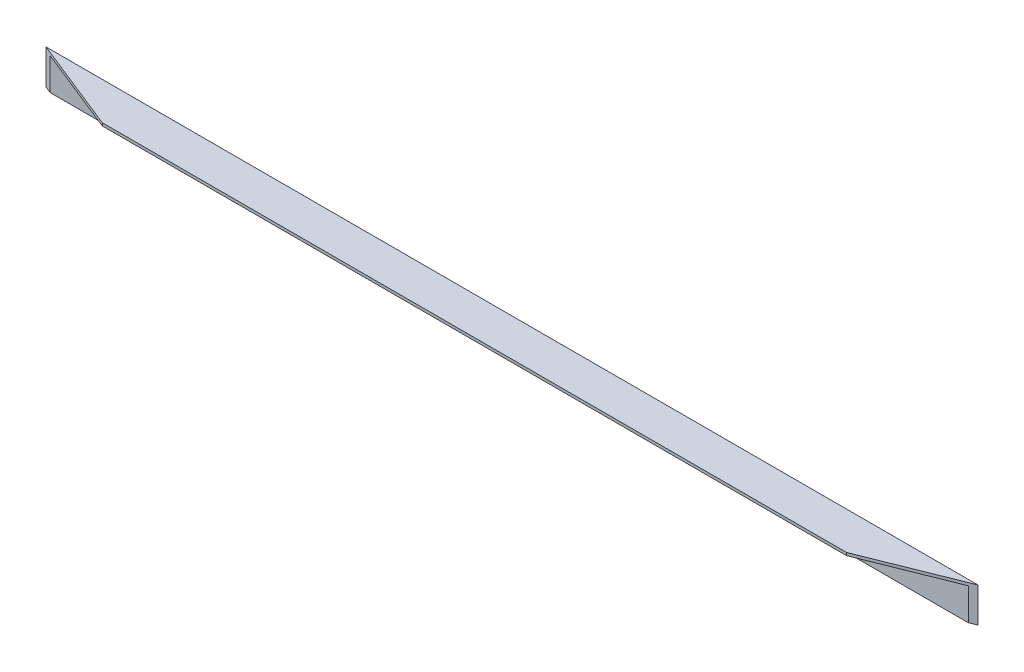
ISO-10303-21;
HEADER;
FILE_DESCRIPTION(('STEP AP214'),'2;1');
FILE_NAME('part.step','',(''),(''),'','','');
FILE_SCHEMA(('AUTOMOTIVE_DESIGN { 1 0 10303 214 1 1 1 1 }'));
ENDSEC;
DATA;
#1=APPLICATION_CONTEXT('core data for automotive mechanical design processes');
#2=APPLICATION_PROTOCOL_DEFINITION('international standard','automotive_design',2000,#1);
#3=PRODUCT_CONTEXT('',#1,'mechanical');
#4=PRODUCT('Part','Part','',(#3));
#5=PRODUCT_RELATED_PRODUCT_CATEGORY('part','',(#4));
#6=PRODUCT_DEFINITION_FORMATION('','',#4);
#7=PRODUCT_DEFINITION_CONTEXT('part definition',#1,'design');
#8=PRODUCT_DEFINITION('design','',#6,#7);
#9=PRODUCT_DEFINITION_SHAPE('','',#8);
#10=(LENGTH_UNIT() NAMED_UNIT(*) SI_UNIT(.MILLI.,.METRE.));
#11=(NAMED_UNIT(*) PLANE_ANGLE_UNIT() SI_UNIT($,.RADIAN.));
#12=(NAMED_UNIT(*) SI_UNIT($,.STERADIAN.) SOLID_ANGLE_UNIT());
#13=UNCERTAINTY_MEASURE_WITH_UNIT(LENGTH_MEASURE(1.E-05),#10,'distance_accuracy_value','');
#14=(GEOMETRIC_REPRESENTATION_CONTEXT(3) GLOBAL_UNCERTAINTY_ASSIGNED_CONTEXT((#13)) GLOBAL_UNIT_ASSIGNED_CONTEXT((#10,
#11,#12)) REPRESENTATION_CONTEXT('',''));
#15=CARTESIAN_POINT('',(0.,0.,0.));
#16=DIRECTION('',(0.,0.,1.));
#17=DIRECTION('',(1.,0.,0.));
#18=AXIS2_PLACEMENT_3D('',#15,#16,#17);
#19=CARTESIAN_POINT('',(-1340.,100.,8.));
#20=DIRECTION('',(0.,0.,-1.));
#21=DIRECTION('',(-1.,0.,0.));
#22=AXIS2_PLACEMENT_3D('',#19,#20,#21);
#23=PLANE('',#22);
#24=DIRECTION('',(1.,0.,0.));
#25=VECTOR('',#24,1.);
#26=CARTESIAN_POINT('',(-1340.,92.,8.));
#27=LINE('',#26,#25);
#28=CARTESIAN_POINT('',(-1320.,92.,8.00000000000001));
#29=VERTEX_POINT('',#28);
#30=CARTESIAN_POINT('',(1320.,92.,8.00000000000006));
#31=VERTEX_POINT('',#30);
#32=EDGE_CURVE('E36',#29,#31,#27,.T.);
#33=ORIENTED_EDGE('',*,*,#32,.F.);
#34=DIRECTION('',(0.,-1.,0.));
#35=VECTOR('',#34,1.);
#36=CARTESIAN_POINT('',(-1320.,100.,8.));
#37=LINE('',#36,#35);
#38=CARTESIAN_POINT('',(-1320.,0.,8.));
#39=VERTEX_POINT('',#38);
#40=EDGE_CURVE('E123',#29,#39,#37,.T.);
#41=ORIENTED_EDGE('',*,*,#40,.T.);
#42=DIRECTION('',(1.,0.,0.));
#43=VECTOR('',#42,1.);
#44=CARTESIAN_POINT('',(-1340.,0.,8.));
#45=LINE('',#44,#43);
#46=CARTESIAN_POINT('',(1320.,0.,8.));
#47=VERTEX_POINT('',#46);
#48=EDGE_CURVE('E100',#39,#47,#45,.T.);
#49=ORIENTED_EDGE('',*,*,#48,.T.);
#50=DIRECTION('',(0.,1.,0.));
#51=VECTOR('',#50,1.);
#52=CARTESIAN_POINT('',(1320.,100.,8.));
#53=LINE('',#52,#51);
#54=EDGE_CURVE('E122',#47,#31,#53,.T.);
#55=ORIENTED_EDGE('',*,*,#54,.T.);
#56=EDGE_LOOP('',(#33,#41,#49,#55));
#57=FACE_BOUND('',#56,.T.);
#58=ADVANCED_FACE('F32',(#57),#23,.F.);
#59=CARTESIAN_POINT('',(-1340.,100.,0.));
#60=DIRECTION('',(0.,0.,-1.));
#61=DIRECTION('',(-1.,0.,0.));
#62=AXIS2_PLACEMENT_3D('',#59,#60,#61);
#63=PLANE('',#62);
#64=DIRECTION('',(0.,1.,0.));
#65=VECTOR('',#64,1.);
#66=CARTESIAN_POINT('',(1340.,0.,0.));
#67=LINE('',#66,#65);
#68=CARTESIAN_POINT('',(1340.,0.,0.));
#69=VERTEX_POINT('',#68);
#70=CARTESIAN_POINT('',(1340.,100.,0.));
#71=VERTEX_POINT('',#70);
#72=EDGE_CURVE('E101',#69,#71,#67,.T.);
#73=ORIENTED_EDGE('',*,*,#72,.F.);
#74=DIRECTION('',(1.,0.,0.));
#75=VECTOR('',#74,1.);
#76=CARTESIAN_POINT('',(-1340.,0.,0.));
#77=LINE('',#76,#75);
#78=CARTESIAN_POINT('',(-1340.,0.,0.));
#79=VERTEX_POINT('',#78);
#80=EDGE_CURVE('E105',#79,#69,#77,.T.);
#81=ORIENTED_EDGE('',*,*,#80,.F.);
#82=DIRECTION('',(0.,-1.,0.));
#83=VECTOR('',#82,1.);
#84=CARTESIAN_POINT('',(-1340.,0.,0.));
#85=LINE('',#84,#83);
#86=CARTESIAN_POINT('',(-1340.,100.,0.));
#87=VERTEX_POINT('',#86);
#88=EDGE_CURVE('E89',#87,#79,#85,.T.);
#89=ORIENTED_EDGE('',*,*,#88,.F.);
#90=DIRECTION('',(-1.,0.,0.));
#91=VECTOR('',#90,1.);
#92=CARTESIAN_POINT('',(-1340.,100.,0.));
#93=LINE('',#92,#91);
#94=EDGE_CURVE('E96',#71,#87,#93,.T.);
#95=ORIENTED_EDGE('',*,*,#94,.F.);
#96=EDGE_LOOP('',(#73,#81,#89,#95));
#97=FACE_BOUND('',#96,.T.);
#98=ADVANCED_FACE('F104',(#97),#63,.T.);
#99=CARTESIAN_POINT('',(-1340.,0.,8.));
#100=DIRECTION('',(0.,1.,0.));
#101=DIRECTION('',(0.,0.,1.));
#102=AXIS2_PLACEMENT_3D('',#99,#100,#101);
#103=PLANE('',#102);
#104=DIRECTION('',(-0.928476690885259,0.,0.371390676354104));
#105=VECTOR('',#104,1.);
#106=CARTESIAN_POINT('',(-973.103448275862,0.,925.241379310345));
#107=LINE('',#106,#105);
#108=EDGE_CURVE('E128',#69,#47,#107,.T.);
#109=ORIENTED_EDGE('',*,*,#108,.T.);
#110=ORIENTED_EDGE('',*,*,#48,.F.);
#111=DIRECTION('',(-0.928476690885259,0.,-0.371390676354104));
#112=VECTOR('',#111,1.);
#113=CARTESIAN_POINT('',(-1337.24137931034,0.,1.10344827586207));
#114=LINE('',#113,#112);
#115=EDGE_CURVE('E140',#39,#79,#114,.T.);
#116=ORIENTED_EDGE('',*,*,#115,.T.);
#117=ORIENTED_EDGE('',*,*,#80,.T.);
#118=EDGE_LOOP('',(#109,#110,#116,#117));
#119=FACE_BOUND('',#118,.T.);
#120=ADVANCED_FACE('F34',(#119),#103,.F.);
#121=CARTESIAN_POINT('',(-1340.,100.,8.));
#122=DIRECTION('',(0.,-1.,0.));
#123=DIRECTION('',(0.,0.,-1.));
#124=AXIS2_PLACEMENT_3D('',#121,#122,#123);
#125=PLANE('',#124);
#126=ORIENTED_EDGE('',*,*,#94,.T.);
#127=DIRECTION('',(-0.928476690885259,0.,-0.371390676354104));
#128=VECTOR('',#127,1.);
#129=CARTESIAN_POINT('',(-1340.,100.,0.));
#130=LINE('',#129,#128);
#131=CARTESIAN_POINT('',(-1070.,100.,108.));
#132=VERTEX_POINT('',#131);
#133=EDGE_CURVE('E85',#132,#87,#130,.T.);
#134=ORIENTED_EDGE('',*,*,#133,.F.);
#135=DIRECTION('',(-1.,0.,0.));
#136=VECTOR('',#135,1.);
#137=CARTESIAN_POINT('',(-1340.,100.,108.));
#138=LINE('',#137,#136);
#139=CARTESIAN_POINT('',(1070.,100.,108.));
#140=VERTEX_POINT('',#139);
#141=EDGE_CURVE('E106',#140,#132,#138,.T.);
#142=ORIENTED_EDGE('',*,*,#141,.F.);
#143=DIRECTION('',(-0.928476690885259,0.,0.371390676354104));
#144=VECTOR('',#143,1.);
#145=CARTESIAN_POINT('',(1340.,100.,0.));
#146=LINE('',#145,#144);
#147=EDGE_CURVE('E56',#71,#140,#146,.T.);
#148=ORIENTED_EDGE('',*,*,#147,.F.);
#149=EDGE_LOOP('',(#126,#134,#142,#148));
#150=FACE_BOUND('',#149,.T.);
#151=ADVANCED_FACE('F97',(#150),#125,.F.);
#152=CARTESIAN_POINT('',(-1340.,92.,108.));
#153=DIRECTION('',(0.,1.,0.));
#154=DIRECTION('',(0.,0.,1.));
#155=AXIS2_PLACEMENT_3D('',#152,#153,#154);
#156=PLANE('',#155);
#157=DIRECTION('',(1.,0.,0.));
#158=VECTOR('',#157,1.);
#159=CARTESIAN_POINT('',(-1340.,92.,108.));
#160=LINE('',#159,#158);
#161=CARTESIAN_POINT('',(-1070.,92.,108.));
#162=VERTEX_POINT('',#161);
#163=CARTESIAN_POINT('',(1070.,92.,108.));
#164=VERTEX_POINT('',#163);
#165=EDGE_CURVE('E109',#162,#164,#160,.T.);
#166=ORIENTED_EDGE('',*,*,#165,.F.);
#167=DIRECTION('',(-0.928476690885259,0.,-0.371390676354104));
#168=VECTOR('',#167,1.);
#169=CARTESIAN_POINT('',(-1302.75862068966,92.,14.8965517241379));
#170=LINE('',#169,#168);
#171=EDGE_CURVE('E48',#162,#29,#170,.T.);
#172=ORIENTED_EDGE('',*,*,#171,.T.);
#173=ORIENTED_EDGE('',*,*,#32,.T.);
#174=DIRECTION('',(-0.928476690885259,0.,0.371390676354104));
#175=VECTOR('',#174,1.);
#176=CARTESIAN_POINT('',(-1007.58620689655,92.,939.034482758621));
#177=LINE('',#176,#175);
#178=EDGE_CURVE('E129',#31,#164,#177,.T.);
#179=ORIENTED_EDGE('',*,*,#178,.T.);
#180=EDGE_LOOP('',(#166,#172,#173,#179));
#181=FACE_BOUND('',#180,.T.);
#182=ADVANCED_FACE('F139',(#181),#156,.F.);
#183=CARTESIAN_POINT('',(-1340.,92.,108.));
#184=DIRECTION('',(0.,0.,1.));
#185=DIRECTION('',(1.,0.,0.));
#186=AXIS2_PLACEMENT_3D('',#183,#184,#185);
#187=PLANE('',#186);
#188=DIRECTION('',(0.,1.,0.));
#189=VECTOR('',#188,1.);
#190=CARTESIAN_POINT('',(-1070.,92.,108.));
#191=LINE('',#190,#189);
#192=EDGE_CURVE('E11',#162,#132,#191,.T.);
#193=ORIENTED_EDGE('',*,*,#192,.F.);
#194=ORIENTED_EDGE('',*,*,#165,.T.);
#195=DIRECTION('',(0.,-1.,0.));
#196=VECTOR('',#195,1.);
#197=CARTESIAN_POINT('',(1070.,92.,108.));
#198=LINE('',#197,#196);
#199=EDGE_CURVE('E42',#140,#164,#198,.T.);
#200=ORIENTED_EDGE('',*,*,#199,.F.);
#201=ORIENTED_EDGE('',*,*,#141,.T.);
#202=EDGE_LOOP('',(#193,#194,#200,#201));
#203=FACE_BOUND('',#202,.T.);
#204=ADVANCED_FACE('F137',(#203),#187,.T.);
#205=CARTESIAN_POINT('',(1340.,-2.50000000007189E-05,0.));
#206=DIRECTION('',(-0.371390676354104,0.,-0.928476690885259));
#207=DIRECTION('',(-0.928476690885259,0.,0.371390676354104));
#208=AXIS2_PLACEMENT_3D('',#205,#206,#207);
#209=PLANE('',#208);
#210=ORIENTED_EDGE('',*,*,#72,.T.);
#211=ORIENTED_EDGE('',*,*,#147,.T.);
#212=ORIENTED_EDGE('',*,*,#199,.T.);
#213=ORIENTED_EDGE('',*,*,#178,.F.);
#214=ORIENTED_EDGE('',*,*,#54,.F.);
#215=ORIENTED_EDGE('',*,*,#108,.F.);
#216=EDGE_LOOP('',(#210,#211,#212,#213,#214,#215));
#217=FACE_BOUND('',#216,.T.);
#218=ADVANCED_FACE('F127',(#217),#209,.F.);
#219=CARTESIAN_POINT('',(-1340.,-2.50000000007189E-05,0.));
#220=DIRECTION('',(0.371390676354104,0.,-0.928476690885259));
#221=DIRECTION('',(-0.928476690885259,0.,-0.371390676354104));
#222=AXIS2_PLACEMENT_3D('',#219,#220,#221);
#223=PLANE('',#222);
#224=ORIENTED_EDGE('',*,*,#40,.F.);
#225=ORIENTED_EDGE('',*,*,#171,.F.);
#226=ORIENTED_EDGE('',*,*,#192,.T.);
#227=ORIENTED_EDGE('',*,*,#133,.T.);
#228=ORIENTED_EDGE('',*,*,#88,.T.);
#229=ORIENTED_EDGE('',*,*,#115,.F.);
#230=EDGE_LOOP('',(#224,#225,#226,#227,#228,#229));
#231=FACE_BOUND('',#230,.T.);
#232=ADVANCED_FACE('F87',(#231),#223,.F.);
#233=CLOSED_SHELL('',(#58,#98,#120,#151,#182,#204,#218,#232));
#234=MANIFOLD_SOLID_BREP('B2',#233);
#235=ADVANCED_BREP_SHAPE_REPRESENTATION('',(#18,#234),#14);
#236=SHAPE_DEFINITION_REPRESENTATION(#9,#235);
ENDSEC;
END-ISO-10303-21;
